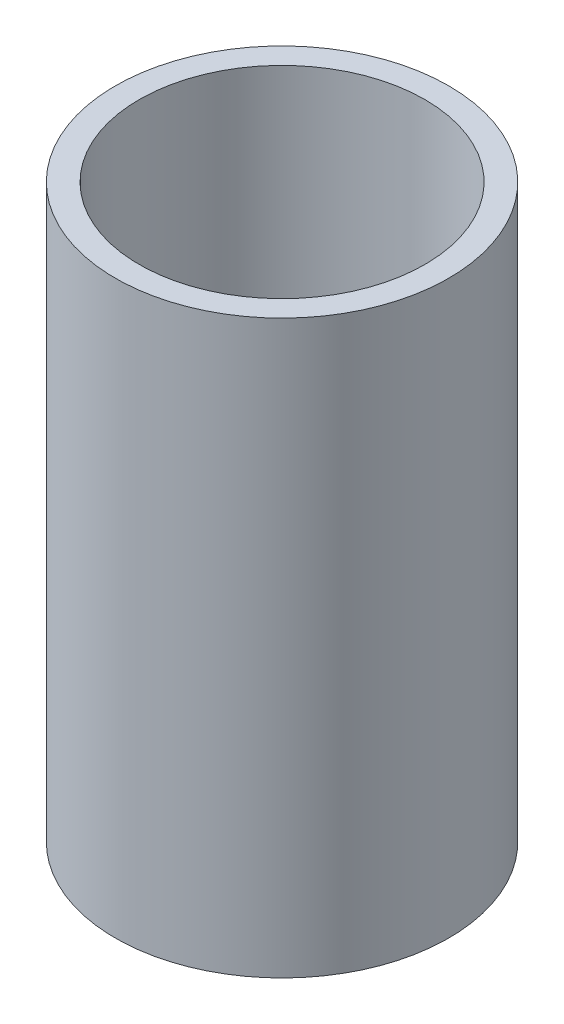
ISO-10303-21;
HEADER;
FILE_DESCRIPTION(('STEP AP214'),'2;1');
FILE_NAME('part.step','',(''),(''),'','','');
FILE_SCHEMA(('AUTOMOTIVE_DESIGN { 1 0 10303 214 1 1 1 1 }'));
ENDSEC;
DATA;
#1=APPLICATION_CONTEXT('core data for automotive mechanical design processes');
#2=APPLICATION_PROTOCOL_DEFINITION('international standard','automotive_design',2000,#1);
#3=PRODUCT_CONTEXT('',#1,'mechanical');
#4=PRODUCT('Part','Part','',(#3));
#5=PRODUCT_RELATED_PRODUCT_CATEGORY('part','',(#4));
#6=PRODUCT_DEFINITION_FORMATION('','',#4);
#7=PRODUCT_DEFINITION_CONTEXT('part definition',#1,'design');
#8=PRODUCT_DEFINITION('design','',#6,#7);
#9=PRODUCT_DEFINITION_SHAPE('','',#8);
#10=(LENGTH_UNIT() NAMED_UNIT(*) SI_UNIT(.MILLI.,.METRE.));
#11=(NAMED_UNIT(*) PLANE_ANGLE_UNIT() SI_UNIT($,.RADIAN.));
#12=(NAMED_UNIT(*) SI_UNIT($,.STERADIAN.) SOLID_ANGLE_UNIT());
#13=UNCERTAINTY_MEASURE_WITH_UNIT(LENGTH_MEASURE(1.E-05),#10,'distance_accuracy_value','');
#14=(GEOMETRIC_REPRESENTATION_CONTEXT(3) GLOBAL_UNCERTAINTY_ASSIGNED_CONTEXT((#13)) GLOBAL_UNIT_ASSIGNED_CONTEXT((#10,
#11,#12)) REPRESENTATION_CONTEXT('',''));
#15=CARTESIAN_POINT('',(0.,0.,0.));
#16=DIRECTION('',(0.,0.,1.));
#17=DIRECTION('',(1.,0.,0.));
#18=AXIS2_PLACEMENT_3D('',#15,#16,#17);
#19=CARTESIAN_POINT('',(0.,76.2,0.));
#20=DIRECTION('',(0.,1.,0.));
#21=DIRECTION('',(0.,0.,1.));
#22=AXIS2_PLACEMENT_3D('',#19,#20,#21);
#23=PLANE('',#22);
#24=CARTESIAN_POINT('',(0.,76.2,0.));
#25=DIRECTION('',(0.,1.,0.));
#26=DIRECTION('',(0.,0.,1.));
#27=AXIS2_PLACEMENT_3D('',#24,#25,#26);
#28=CIRCLE('',#27,22.225);
#29=CARTESIAN_POINT('',(0.,76.2,-22.225));
#30=VERTEX_POINT('',#29);
#31=EDGE_CURVE('E10',#30,#30,#28,.T.);
#32=ORIENTED_EDGE('',*,*,#31,.T.);
#33=EDGE_LOOP('',(#32));
#34=FACE_BOUND('',#33,.T.);
#35=CARTESIAN_POINT('',(0.,76.2,0.));
#36=DIRECTION('',(0.,1.,0.));
#37=DIRECTION('',(0.,0.,1.));
#38=AXIS2_PLACEMENT_3D('',#35,#36,#37);
#39=CIRCLE('',#38,19.05);
#40=CARTESIAN_POINT('',(0.,76.2,-19.05));
#41=VERTEX_POINT('',#40);
#42=EDGE_CURVE('E50',#41,#41,#39,.T.);
#43=ORIENTED_EDGE('',*,*,#42,.F.);
#44=EDGE_LOOP('',(#43));
#45=FACE_BOUND('',#44,.T.);
#46=ADVANCED_FACE('F37',(#34,#45),#23,.T.);
#47=CARTESIAN_POINT('',(0.,0.,0.));
#48=DIRECTION('',(0.,1.,0.));
#49=DIRECTION('',(0.,0.,1.));
#50=AXIS2_PLACEMENT_3D('',#47,#48,#49);
#51=PLANE('',#50);
#52=CARTESIAN_POINT('',(0.,0.,0.));
#53=DIRECTION('',(0.,1.,0.));
#54=DIRECTION('',(0.,0.,1.));
#55=AXIS2_PLACEMENT_3D('',#52,#53,#54);
#56=CIRCLE('',#55,22.225);
#57=CARTESIAN_POINT('',(0.,0.,-22.225));
#58=VERTEX_POINT('',#57);
#59=EDGE_CURVE('E41',#58,#58,#56,.T.);
#60=ORIENTED_EDGE('',*,*,#59,.F.);
#61=EDGE_LOOP('',(#60));
#62=FACE_BOUND('',#61,.T.);
#63=CARTESIAN_POINT('',(0.,0.,0.));
#64=DIRECTION('',(0.,1.,0.));
#65=DIRECTION('',(0.,0.,1.));
#66=AXIS2_PLACEMENT_3D('',#63,#64,#65);
#67=CIRCLE('',#66,19.05);
#68=CARTESIAN_POINT('',(0.,0.,-19.05));
#69=VERTEX_POINT('',#68);
#70=EDGE_CURVE('E52',#69,#69,#67,.T.);
#71=ORIENTED_EDGE('',*,*,#70,.T.);
#72=EDGE_LOOP('',(#71));
#73=FACE_BOUND('',#72,.T.);
#74=ADVANCED_FACE('F64',(#62,#73),#51,.F.);
#75=CARTESIAN_POINT('',(0.,76.2,0.));
#76=DIRECTION('',(0.,-1.,0.));
#77=DIRECTION('',(0.,0.,-1.));
#78=AXIS2_PLACEMENT_3D('',#75,#76,#77);
#79=CYLINDRICAL_SURFACE('',#78,22.225);
#80=CARTESIAN_POINT('',(0.,76.2,-22.225));
#81=CARTESIAN_POINT('',(0.,75.40625,-22.225));
#82=CARTESIAN_POINT('',(0.,74.6125,-22.225));
#83=CARTESIAN_POINT('',(0.,73.025,-22.225));
#84=CARTESIAN_POINT('',(0.,72.23125,-22.225));
#85=CARTESIAN_POINT('',(0.,70.64375,-22.225));
#86=CARTESIAN_POINT('',(0.,69.85,-22.225));
#87=CARTESIAN_POINT('',(0.,68.2625,-22.225));
#88=CARTESIAN_POINT('',(0.,67.46875,-22.225));
#89=CARTESIAN_POINT('',(0.,65.88125,-22.225));
#90=CARTESIAN_POINT('',(0.,65.0875,-22.225));
#91=CARTESIAN_POINT('',(0.,63.5,-22.225));
#92=CARTESIAN_POINT('',(0.,62.70625,-22.225));
#93=CARTESIAN_POINT('',(0.,61.11875,-22.225));
#94=CARTESIAN_POINT('',(0.,60.325,-22.225));
#95=CARTESIAN_POINT('',(0.,58.7375,-22.225));
#96=CARTESIAN_POINT('',(0.,57.94375,-22.225));
#97=CARTESIAN_POINT('',(0.,56.35625,-22.225));
#98=CARTESIAN_POINT('',(0.,55.5625,-22.225));
#99=CARTESIAN_POINT('',(0.,53.975,-22.225));
#100=CARTESIAN_POINT('',(0.,53.18125,-22.225));
#101=CARTESIAN_POINT('',(0.,51.59375,-22.225));
#102=CARTESIAN_POINT('',(0.,50.8,-22.225));
#103=CARTESIAN_POINT('',(0.,49.2125,-22.225));
#104=CARTESIAN_POINT('',(0.,48.41875,-22.225));
#105=CARTESIAN_POINT('',(0.,46.83125,-22.225));
#106=CARTESIAN_POINT('',(0.,46.0375,-22.225));
#107=CARTESIAN_POINT('',(0.,44.45,-22.225));
#108=CARTESIAN_POINT('',(0.,43.65625,-22.225));
#109=CARTESIAN_POINT('',(0.,42.06875,-22.225));
#110=CARTESIAN_POINT('',(0.,41.275,-22.225));
#111=CARTESIAN_POINT('',(0.,39.6875,-22.225));
#112=CARTESIAN_POINT('',(0.,38.89375,-22.225));
#113=CARTESIAN_POINT('',(0.,37.30625,-22.225));
#114=CARTESIAN_POINT('',(0.,36.5125,-22.225));
#115=CARTESIAN_POINT('',(0.,34.925,-22.225));
#116=CARTESIAN_POINT('',(0.,34.13125,-22.225));
#117=CARTESIAN_POINT('',(0.,32.54375,-22.225));
#118=CARTESIAN_POINT('',(0.,31.75,-22.225));
#119=CARTESIAN_POINT('',(0.,30.1625,-22.225));
#120=CARTESIAN_POINT('',(0.,29.36875,-22.225));
#121=CARTESIAN_POINT('',(0.,27.78125,-22.225));
#122=CARTESIAN_POINT('',(0.,26.9875,-22.225));
#123=CARTESIAN_POINT('',(0.,25.4,-22.225));
#124=CARTESIAN_POINT('',(0.,24.60625,-22.225));
#125=CARTESIAN_POINT('',(0.,23.01875,-22.225));
#126=CARTESIAN_POINT('',(0.,22.225,-22.225));
#127=CARTESIAN_POINT('',(0.,20.6375,-22.225));
#128=CARTESIAN_POINT('',(0.,19.84375,-22.225));
#129=CARTESIAN_POINT('',(0.,18.25625,-22.225));
#130=CARTESIAN_POINT('',(0.,17.4625,-22.225));
#131=CARTESIAN_POINT('',(0.,15.875,-22.225));
#132=CARTESIAN_POINT('',(0.,15.08125,-22.225));
#133=CARTESIAN_POINT('',(0.,13.49375,-22.225));
#134=CARTESIAN_POINT('',(0.,12.7,-22.225));
#135=CARTESIAN_POINT('',(0.,11.1125,-22.225));
#136=CARTESIAN_POINT('',(0.,10.31875,-22.225));
#137=CARTESIAN_POINT('',(0.,8.73125,-22.225));
#138=CARTESIAN_POINT('',(0.,7.93750000000001,-22.225));
#139=CARTESIAN_POINT('',(0.,6.35,-22.225));
#140=CARTESIAN_POINT('',(0.,5.55625,-22.225));
#141=CARTESIAN_POINT('',(0.,3.96875,-22.225));
#142=CARTESIAN_POINT('',(0.,3.175,-22.225));
#143=CARTESIAN_POINT('',(0.,1.5875,-22.225));
#144=CARTESIAN_POINT('',(0.,0.793750000000001,-22.225));
#145=CARTESIAN_POINT('',(0.,0.,-22.225));
#146=B_SPLINE_CURVE_WITH_KNOTS('',3,(#80,#81,#82,#83,#84,#85,#86,#87,#88,#89,#90,#91,#92,#93,
#94,#95,#96,#97,#98,#99,#100,#101,#102,#103,#104,#105,#106,#107,#108,#109,#110,#111,#112,#113,
#114,#115,#116,#117,#118,#119,#120,#121,#122,#123,#124,#125,#126,#127,#128,#129,#130,#131,#132,
#133,#134,#135,#136,#137,#138,#139,#140,#141,#142,#143,#144,#145),.UNSPECIFIED.,.F.,.F.,(4,2,2,
2,2,2,2,2,2,2,2,2,2,2,2,2,2,2,2,2,2,2,2,2,2,2,2,2,2,2,2,2,4),(0.,2.38124999999999,
4.76249999999999,7.14374999999999,9.52499999999999,11.90625,14.2875,16.66875,19.05,21.43125,
23.8125,26.19375,28.575,30.95625,33.3375,35.71875,38.1,40.48125,42.8625,45.24375,47.625,
50.00625,52.3875,54.76875,57.15,59.53125,61.9125,64.29375,66.675,69.05625,71.4375,73.81875,
76.2),.UNSPECIFIED.);
#147=EDGE_CURVE('BSEAM39',#30,#58,#146,.T.);
#148=ORIENTED_EDGE('',*,*,#31,.F.);
#149=ORIENTED_EDGE('',*,*,#59,.T.);
#150=ORIENTED_EDGE('',*,*,#147,.T.);
#151=ORIENTED_EDGE('',*,*,#147,.F.);
#152=EDGE_LOOP('',(#148,#150,#149,#151));
#153=FACE_BOUND('',#152,.T.);
#154=ADVANCED_FACE('F39',(#153),#79,.T.);
#155=CARTESIAN_POINT('',(0.,76.2,0.));
#156=DIRECTION('',(0.,-1.,0.));
#157=DIRECTION('',(0.,0.,-1.));
#158=AXIS2_PLACEMENT_3D('',#155,#156,#157);
#159=CYLINDRICAL_SURFACE('',#158,19.05);
#160=CARTESIAN_POINT('',(0.,76.2,-19.05));
#161=CARTESIAN_POINT('',(0.,75.40625,-19.05));
#162=CARTESIAN_POINT('',(0.,74.6125,-19.05));
#163=CARTESIAN_POINT('',(0.,73.025,-19.05));
#164=CARTESIAN_POINT('',(0.,72.23125,-19.05));
#165=CARTESIAN_POINT('',(0.,70.64375,-19.05));
#166=CARTESIAN_POINT('',(0.,69.85,-19.05));
#167=CARTESIAN_POINT('',(0.,68.2625,-19.05));
#168=CARTESIAN_POINT('',(0.,67.46875,-19.05));
#169=CARTESIAN_POINT('',(0.,65.88125,-19.05));
#170=CARTESIAN_POINT('',(0.,65.0875,-19.05));
#171=CARTESIAN_POINT('',(0.,63.5,-19.05));
#172=CARTESIAN_POINT('',(0.,62.70625,-19.05));
#173=CARTESIAN_POINT('',(0.,61.11875,-19.05));
#174=CARTESIAN_POINT('',(0.,60.325,-19.05));
#175=CARTESIAN_POINT('',(0.,58.7375,-19.05));
#176=CARTESIAN_POINT('',(0.,57.94375,-19.05));
#177=CARTESIAN_POINT('',(0.,56.35625,-19.05));
#178=CARTESIAN_POINT('',(0.,55.5625,-19.05));
#179=CARTESIAN_POINT('',(0.,53.975,-19.05));
#180=CARTESIAN_POINT('',(0.,53.18125,-19.05));
#181=CARTESIAN_POINT('',(0.,51.59375,-19.05));
#182=CARTESIAN_POINT('',(0.,50.8,-19.05));
#183=CARTESIAN_POINT('',(0.,49.2125,-19.05));
#184=CARTESIAN_POINT('',(0.,48.41875,-19.05));
#185=CARTESIAN_POINT('',(0.,46.83125,-19.05));
#186=CARTESIAN_POINT('',(0.,46.0375,-19.05));
#187=CARTESIAN_POINT('',(0.,44.45,-19.05));
#188=CARTESIAN_POINT('',(0.,43.65625,-19.05));
#189=CARTESIAN_POINT('',(0.,42.06875,-19.05));
#190=CARTESIAN_POINT('',(0.,41.275,-19.05));
#191=CARTESIAN_POINT('',(0.,39.6875,-19.05));
#192=CARTESIAN_POINT('',(0.,38.89375,-19.05));
#193=CARTESIAN_POINT('',(0.,37.30625,-19.05));
#194=CARTESIAN_POINT('',(0.,36.5125,-19.05));
#195=CARTESIAN_POINT('',(0.,34.925,-19.05));
#196=CARTESIAN_POINT('',(0.,34.13125,-19.05));
#197=CARTESIAN_POINT('',(0.,32.54375,-19.05));
#198=CARTESIAN_POINT('',(0.,31.75,-19.05));
#199=CARTESIAN_POINT('',(0.,30.1625,-19.05));
#200=CARTESIAN_POINT('',(0.,29.36875,-19.05));
#201=CARTESIAN_POINT('',(0.,27.78125,-19.05));
#202=CARTESIAN_POINT('',(0.,26.9875,-19.05));
#203=CARTESIAN_POINT('',(0.,25.4,-19.05));
#204=CARTESIAN_POINT('',(0.,24.60625,-19.05));
#205=CARTESIAN_POINT('',(0.,23.01875,-19.05));
#206=CARTESIAN_POINT('',(0.,22.225,-19.05));
#207=CARTESIAN_POINT('',(0.,20.6375,-19.05));
#208=CARTESIAN_POINT('',(0.,19.84375,-19.05));
#209=CARTESIAN_POINT('',(0.,18.25625,-19.05));
#210=CARTESIAN_POINT('',(0.,17.4625,-19.05));
#211=CARTESIAN_POINT('',(0.,15.875,-19.05));
#212=CARTESIAN_POINT('',(0.,15.08125,-19.05));
#213=CARTESIAN_POINT('',(0.,13.49375,-19.05));
#214=CARTESIAN_POINT('',(0.,12.7,-19.05));
#215=CARTESIAN_POINT('',(0.,11.1125,-19.05));
#216=CARTESIAN_POINT('',(0.,10.31875,-19.05));
#217=CARTESIAN_POINT('',(0.,8.73125,-19.05));
#218=CARTESIAN_POINT('',(0.,7.93750000000001,-19.05));
#219=CARTESIAN_POINT('',(0.,6.35,-19.05));
#220=CARTESIAN_POINT('',(0.,5.55625,-19.05));
#221=CARTESIAN_POINT('',(0.,3.96875,-19.05));
#222=CARTESIAN_POINT('',(0.,3.175,-19.05));
#223=CARTESIAN_POINT('',(0.,1.5875,-19.05));
#224=CARTESIAN_POINT('',(0.,0.793750000000001,-19.05));
#225=CARTESIAN_POINT('',(0.,0.,-19.05));
#226=B_SPLINE_CURVE_WITH_KNOTS('',3,(#160,#161,#162,#163,#164,#165,#166,#167,#168,#169,#170,
#171,#172,#173,#174,#175,#176,#177,#178,#179,#180,#181,#182,#183,#184,#185,#186,#187,#188,#189,
#190,#191,#192,#193,#194,#195,#196,#197,#198,#199,#200,#201,#202,#203,#204,#205,#206,#207,#208,
#209,#210,#211,#212,#213,#214,#215,#216,#217,#218,#219,#220,#221,#222,#223,#224,#225),
.UNSPECIFIED.,.F.,.F.,(4,2,2,2,2,2,2,2,2,2,2,2,2,2,2,2,2,2,2,2,2,2,2,2,2,2,2,2,2,2,2,2,4),(0.,
2.38125,4.7625,7.14375,9.52500000000001,11.90625,14.2875,16.66875,19.05,21.43125,23.8125,
26.19375,28.575,30.95625,33.3375,35.71875,38.1,40.48125,42.8625,45.24375,47.625,50.00625,
52.3875,54.76875,57.15,59.53125,61.9125,64.29375,66.675,69.05625,71.4375,73.81875,76.2),.UNSPECIFIED.);
#227=EDGE_CURVE('BSEAM60',#41,#69,#226,.T.);
#228=ORIENTED_EDGE('',*,*,#42,.T.);
#229=ORIENTED_EDGE('',*,*,#70,.F.);
#230=ORIENTED_EDGE('',*,*,#227,.T.);
#231=ORIENTED_EDGE('',*,*,#227,.F.);
#232=EDGE_LOOP('',(#228,#230,#229,#231));
#233=FACE_BOUND('',#232,.T.);
#234=ADVANCED_FACE('F60',(#233),#159,.F.);
#235=CLOSED_SHELL('',(#46,#74,#154,#234));
#236=MANIFOLD_SOLID_BREP('B2',#235);
#237=ADVANCED_BREP_SHAPE_REPRESENTATION('',(#18,#236),#14);
#238=SHAPE_DEFINITION_REPRESENTATION(#9,#237);
ENDSEC;
END-ISO-10303-21;
